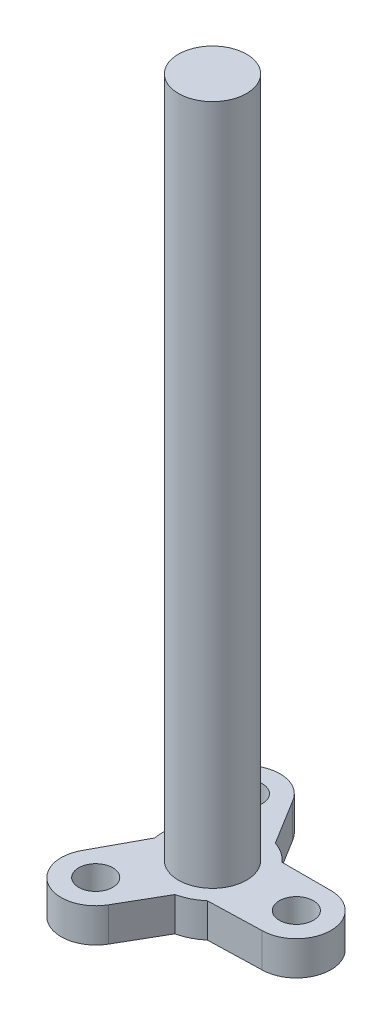
ISO-10303-21;
HEADER;
FILE_DESCRIPTION(('STEP AP214'),'2;1');
FILE_NAME('part.step','',(''),(''),'','','');
FILE_SCHEMA(('AUTOMOTIVE_DESIGN { 1 0 10303 214 1 1 1 1 }'));
ENDSEC;
DATA;
#1=APPLICATION_CONTEXT('core data for automotive mechanical design processes');
#2=APPLICATION_PROTOCOL_DEFINITION('international standard','automotive_design',2000,#1);
#3=PRODUCT_CONTEXT('',#1,'mechanical');
#4=PRODUCT('Part','Part','',(#3));
#5=PRODUCT_RELATED_PRODUCT_CATEGORY('part','',(#4));
#6=PRODUCT_DEFINITION_FORMATION('','',#4);
#7=PRODUCT_DEFINITION_CONTEXT('part definition',#1,'design');
#8=PRODUCT_DEFINITION('design','',#6,#7);
#9=PRODUCT_DEFINITION_SHAPE('','',#8);
#10=(LENGTH_UNIT() NAMED_UNIT(*) SI_UNIT(.MILLI.,.METRE.));
#11=(NAMED_UNIT(*) PLANE_ANGLE_UNIT() SI_UNIT($,.RADIAN.));
#12=(NAMED_UNIT(*) SI_UNIT($,.STERADIAN.) SOLID_ANGLE_UNIT());
#13=UNCERTAINTY_MEASURE_WITH_UNIT(LENGTH_MEASURE(1.E-05),#10,'distance_accuracy_value','');
#14=(GEOMETRIC_REPRESENTATION_CONTEXT(3) GLOBAL_UNCERTAINTY_ASSIGNED_CONTEXT((#13)) GLOBAL_UNIT_ASSIGNED_CONTEXT((#10,
#11,#12)) REPRESENTATION_CONTEXT('',''));
#15=CARTESIAN_POINT('',(0.,0.,0.));
#16=DIRECTION('',(0.,0.,1.));
#17=DIRECTION('',(1.,0.,0.));
#18=AXIS2_PLACEMENT_3D('',#15,#16,#17);
#19=CARTESIAN_POINT('',(4.99942354994192,-2.,0.0759221198740295));
#20=DIRECTION('',(0.,1.,0.));
#21=DIRECTION('',(0.,0.,1.));
#22=AXIS2_PLACEMENT_3D('',#19,#20,#21);
#23=CYLINDRICAL_SURFACE('',#22,1.);
#24=CARTESIAN_POINT('',(4.99942354994192,-2.,0.0759221198740295));
#25=DIRECTION('',(0.,-1.,0.));
#26=DIRECTION('',(0.,0.,-1.));
#27=AXIS2_PLACEMENT_3D('',#24,#25,#26);
#28=CIRCLE('',#27,1.);
#29=CARTESIAN_POINT('',(4.99942354994192,-2.,-0.92407788012597));
#30=VERTEX_POINT('',#29);
#31=EDGE_CURVE('E284',#30,#30,#28,.T.);
#32=ORIENTED_EDGE('',*,*,#31,.T.);
#33=EDGE_LOOP('',(#32));
#34=FACE_BOUND('',#33,.T.);
#35=CARTESIAN_POINT('',(4.99942354994192,0.,0.0759221198740295));
#36=DIRECTION('',(0.,-1.,0.));
#37=DIRECTION('',(0.,0.,-1.));
#38=AXIS2_PLACEMENT_3D('',#35,#36,#37);
#39=CIRCLE('',#38,1.);
#40=CARTESIAN_POINT('',(4.99942354994192,0.,-0.92407788012597));
#41=VERTEX_POINT('',#40);
#42=EDGE_CURVE('E270',#41,#41,#39,.T.);
#43=ORIENTED_EDGE('',*,*,#42,.F.);
#44=EDGE_LOOP('',(#43));
#45=FACE_BOUND('',#44,.T.);
#46=ADVANCED_FACE('F133',(#34,#45),#23,.F.);
#47=CARTESIAN_POINT('',(-2.4339612904509,-2.,-4.36758885846488));
#48=DIRECTION('',(0.,1.,0.));
#49=DIRECTION('',(0.,0.,1.));
#50=AXIS2_PLACEMENT_3D('',#47,#48,#49);
#51=CYLINDRICAL_SURFACE('',#50,1.);
#52=CARTESIAN_POINT('',(-2.4339612904509,-2.,-4.36758885846488));
#53=DIRECTION('',(0.,-1.,0.));
#54=DIRECTION('',(0.,0.,-1.));
#55=AXIS2_PLACEMENT_3D('',#52,#53,#54);
#56=CIRCLE('',#55,1.);
#57=CARTESIAN_POINT('',(-2.4339612904509,-2.,-5.36758885846488));
#58=VERTEX_POINT('',#57);
#59=EDGE_CURVE('E258',#58,#58,#56,.T.);
#60=ORIENTED_EDGE('',*,*,#59,.T.);
#61=EDGE_LOOP('',(#60));
#62=FACE_BOUND('',#61,.T.);
#63=CARTESIAN_POINT('',(-2.4339612904509,0.,-4.36758885846488));
#64=DIRECTION('',(0.,-1.,0.));
#65=DIRECTION('',(0.,0.,-1.));
#66=AXIS2_PLACEMENT_3D('',#63,#64,#65);
#67=CIRCLE('',#66,1.);
#68=CARTESIAN_POINT('',(-2.4339612904509,0.,-5.36758885846488));
#69=VERTEX_POINT('',#68);
#70=EDGE_CURVE('E274',#69,#69,#67,.T.);
#71=ORIENTED_EDGE('',*,*,#70,.F.);
#72=EDGE_LOOP('',(#71));
#73=FACE_BOUND('',#72,.T.);
#74=ADVANCED_FACE('F374',(#62,#73),#51,.F.);
#75=CARTESIAN_POINT('',(0.0645760588909861,-2.,2.24672430709711));
#76=DIRECTION('',(-0.0287304505466221,0.,-0.999587195401876));
#77=DIRECTION('',(-0.999587195401876,0.,0.0287304505466221));
#78=AXIS2_PLACEMENT_3D('',#75,#76,#77);
#79=PLANE('',#78);
#80=DIRECTION('',(-0.999587195401876,0.,0.0287304505466221));
#81=VECTOR('',#80,1.);
#82=CARTESIAN_POINT('',(0.0645760588909861,0.,2.24672430709711));
#83=LINE('',#82,#81);
#84=CARTESIAN_POINT('',(4.99942354994192,0.,2.10488536353225));
#85=VERTEX_POINT('',#84);
#86=CARTESIAN_POINT('',(1.89164149743137,0.,2.19421021581133));
#87=VERTEX_POINT('',#86);
#88=EDGE_CURVE('E312',#85,#87,#83,.T.);
#89=ORIENTED_EDGE('',*,*,#88,.T.);
#90=DIRECTION('',(0.,1.,0.));
#91=VECTOR('',#90,1.);
#92=CARTESIAN_POINT('',(1.89164149743137,-2.,2.19421021581133));
#93=LINE('',#92,#91);
#94=CARTESIAN_POINT('',(1.89164149743137,-2.,2.19421021581133));
#95=VERTEX_POINT('',#94);
#96=EDGE_CURVE('E143',#95,#87,#93,.T.);
#97=ORIENTED_EDGE('',*,*,#96,.F.);
#98=DIRECTION('',(-0.999587195401876,0.,0.0287304505466221));
#99=VECTOR('',#98,1.);
#100=CARTESIAN_POINT('',(0.0645760588909861,-2.,2.24672430709711));
#101=LINE('',#100,#99);
#102=CARTESIAN_POINT('',(4.99942354994192,-2.,2.10488536353225));
#103=VERTEX_POINT('',#102);
#104=EDGE_CURVE('E203',#103,#95,#101,.T.);
#105=ORIENTED_EDGE('',*,*,#104,.F.);
#106=DIRECTION('',(0.,1.,0.));
#107=VECTOR('',#106,1.);
#108=CARTESIAN_POINT('',(4.99942354994192,-2.,2.10488536353225));
#109=LINE('',#108,#107);
#110=EDGE_CURVE('E13',#103,#85,#109,.T.);
#111=ORIENTED_EDGE('',*,*,#110,.T.);
#112=EDGE_LOOP('',(#89,#97,#105,#111));
#113=FACE_BOUND('',#112,.T.);
#114=ADVANCED_FACE('F380',(#113),#79,.F.);
#115=CARTESIAN_POINT('',(0.,-2.,0.));
#116=DIRECTION('',(0.,1.,0.));
#117=DIRECTION('',(0.,0.,1.));
#118=AXIS2_PLACEMENT_3D('',#115,#116,#117);
#119=CYLINDRICAL_SURFACE('',#118,2.89704436037407);
#120=CARTESIAN_POINT('',(0.,0.,0.));
#121=DIRECTION('',(0.,-1.,0.));
#122=DIRECTION('',(0.,0.,-1.));
#123=AXIS2_PLACEMENT_3D('',#120,#121,#122);
#124=CIRCLE('',#123,2.89704436037407);
#125=CARTESIAN_POINT('',(0.621512161444119,0.,2.82959160642525));
#126=VERTEX_POINT('',#125);
#127=EDGE_CURVE('E334',#87,#126,#124,.T.);
#128=ORIENTED_EDGE('',*,*,#127,.T.);
#129=DIRECTION('',(0.,1.,0.));
#130=VECTOR('',#129,1.);
#131=CARTESIAN_POINT('',(0.621512161444119,-2.,2.82959160642525));
#132=LINE('',#131,#130);
#133=CARTESIAN_POINT('',(0.621512161444119,-2.,2.82959160642525));
#134=VERTEX_POINT('',#133);
#135=EDGE_CURVE('E298',#134,#126,#132,.T.);
#136=ORIENTED_EDGE('',*,*,#135,.F.);
#137=CARTESIAN_POINT('',(0.,-2.,0.));
#138=DIRECTION('',(0.,-1.,0.));
#139=DIRECTION('',(0.,0.,-1.));
#140=AXIS2_PLACEMENT_3D('',#137,#138,#139);
#141=CIRCLE('',#140,2.89704436037407);
#142=EDGE_CURVE('E257',#95,#134,#141,.T.);
#143=ORIENTED_EDGE('',*,*,#142,.F.);
#144=ORIENTED_EDGE('',*,*,#96,.T.);
#145=EDGE_LOOP('',(#128,#136,#143,#144));
#146=FACE_BOUND('',#145,.T.);
#147=ADVANCED_FACE('F392',(#146),#119,.T.);
#148=CARTESIAN_POINT('',(1.69138322783282,-2.,0.976520561892078));
#149=DIRECTION('',(0.866025403784443,0.,0.499999999999992));
#150=DIRECTION('',(0.499999999999992,0.,-0.866025403784443));
#151=AXIS2_PLACEMENT_3D('',#148,#149,#150);
#152=PLANE('',#151);
#153=DIRECTION('',(0.499999999999992,0.,-0.866025403784443));
#154=VECTOR('',#153,1.);
#155=CARTESIAN_POINT('',(1.69138322783282,0.,0.976520561892078));
#156=LINE('',#155,#154);
#157=CARTESIAN_POINT('',(-0.808328547138092,0.,5.30614836041998));
#158=VERTEX_POINT('',#157);
#159=EDGE_CURVE('E330',#158,#126,#156,.T.);
#160=ORIENTED_EDGE('',*,*,#159,.F.);
#161=DIRECTION('',(0.,1.,0.));
#162=VECTOR('',#161,1.);
#163=CARTESIAN_POINT('',(-0.808328547138092,-2.,5.30614836041998));
#164=LINE('',#163,#162);
#165=CARTESIAN_POINT('',(-0.808328547138092,-2.,5.30614836041998));
#166=VERTEX_POINT('',#165);
#167=EDGE_CURVE('E296',#166,#158,#164,.T.);
#168=ORIENTED_EDGE('',*,*,#167,.F.);
#169=DIRECTION('',(0.499999999999992,0.,-0.866025403784443));
#170=VECTOR('',#169,1.);
#171=CARTESIAN_POINT('',(1.69138322783282,-2.,0.976520561892078));
#172=LINE('',#171,#170);
#173=EDGE_CURVE('E264',#166,#134,#172,.T.);
#174=ORIENTED_EDGE('',*,*,#173,.T.);
#175=ORIENTED_EDGE('',*,*,#135,.T.);
#176=EDGE_LOOP('',(#160,#168,#174,#175));
#177=FACE_BOUND('',#176,.T.);
#178=ADVANCED_FACE('F396',(#177),#152,.T.);
#179=CARTESIAN_POINT('',(-1.97800835469159,-2.,-1.06743764607266));
#180=DIRECTION('',(0.88003312978898,0.,0.474912297665383));
#181=DIRECTION('',(0.474912297665382,0.,-0.88003312978898));
#182=AXIS2_PLACEMENT_3D('',#179,#180,#181);
#183=PLANE('',#182);
#184=DIRECTION('',(0.474912297665382,0.,-0.88003312978898));
#185=VECTOR('',#184,1.);
#186=CARTESIAN_POINT('',(-1.97800835469159,0.,-1.06743764607266));
#187=LINE('',#186,#185);
#188=CARTESIAN_POINT('',(-4.3225959718439,0.,3.2771851167618));
#189=VERTEX_POINT('',#188);
#190=CARTESIAN_POINT('',(-2.84606253685163,0.,0.541104483722762));
#191=VERTEX_POINT('',#190);
#192=EDGE_CURVE('E322',#189,#191,#187,.T.);
#193=ORIENTED_EDGE('',*,*,#192,.T.);
#194=DIRECTION('',(0.,1.,0.));
#195=VECTOR('',#194,1.);
#196=CARTESIAN_POINT('',(-2.84606253685163,-2.,0.541104483722762));
#197=LINE('',#196,#195);
#198=CARTESIAN_POINT('',(-2.84606253685163,-2.,0.541104483722762));
#199=VERTEX_POINT('',#198);
#200=EDGE_CURVE('E291',#199,#191,#197,.T.);
#201=ORIENTED_EDGE('',*,*,#200,.F.);
#202=DIRECTION('',(0.474912297665382,0.,-0.88003312978898));
#203=VECTOR('',#202,1.);
#204=CARTESIAN_POINT('',(-1.97800835469159,-2.,-1.06743764607266));
#205=LINE('',#204,#203);
#206=CARTESIAN_POINT('',(-4.3225959718439,-2.,3.2771851167618));
#207=VERTEX_POINT('',#206);
#208=EDGE_CURVE('E263',#207,#199,#205,.T.);
#209=ORIENTED_EDGE('',*,*,#208,.F.);
#210=DIRECTION('',(0.,1.,0.));
#211=VECTOR('',#210,1.);
#212=CARTESIAN_POINT('',(-4.3225959718439,-2.,3.2771851167618));
#213=LINE('',#212,#211);
#214=EDGE_CURVE('E294',#207,#189,#213,.T.);
#215=ORIENTED_EDGE('',*,*,#214,.T.);
#216=EDGE_LOOP('',(#193,#201,#209,#215));
#217=FACE_BOUND('',#216,.T.);
#218=ADVANCED_FACE('F356',(#217),#183,.F.);
#219=CARTESIAN_POINT('',(-2.76125429422154,0.,-0.876550482641058));
#220=VERTEX_POINT('',#219);
#221=EDGE_CURVE('E327',#191,#220,#124,.T.);
#222=ORIENTED_EDGE('',*,*,#221,.T.);
#223=DIRECTION('',(0.,1.,0.));
#224=VECTOR('',#223,1.);
#225=CARTESIAN_POINT('',(-2.76125429422154,-2.,-0.876550482641058));
#226=LINE('',#225,#224);
#227=CARTESIAN_POINT('',(-2.76125429422154,-2.,-0.876550482641058));
#228=VERTEX_POINT('',#227);
#229=EDGE_CURVE('E289',#228,#220,#226,.T.);
#230=ORIENTED_EDGE('',*,*,#229,.F.);
#231=EDGE_CURVE('E256',#199,#228,#141,.T.);
#232=ORIENTED_EDGE('',*,*,#231,.F.);
#233=ORIENTED_EDGE('',*,*,#200,.T.);
#234=EDGE_LOOP('',(#222,#230,#232,#233));
#235=FACE_BOUND('',#234,.T.);
#236=ADVANCED_FACE('F358',(#235),#119,.T.);
#237=CARTESIAN_POINT('',(-1.69138322783281,-2.,0.976520561892103));
#238=DIRECTION('',(-0.866025403784436,0.,0.500000000000004));
#239=DIRECTION('',(0.500000000000004,0.,0.866025403784436));
#240=AXIS2_PLACEMENT_3D('',#237,#238,#239);
#241=PLANE('',#240);
#242=DIRECTION('',(0.500000000000004,0.,0.866025403784436));
#243=VECTOR('',#242,1.);
#244=CARTESIAN_POINT('',(-1.69138322783281,0.,0.976520561892103));
#245=LINE('',#244,#243);
#246=CARTESIAN_POINT('',(-4.19109500280379,0.,-3.35310723663577));
#247=VERTEX_POINT('',#246);
#248=EDGE_CURVE('E332',#247,#220,#245,.T.);
#249=ORIENTED_EDGE('',*,*,#248,.F.);
#250=DIRECTION('',(0.,1.,0.));
#251=VECTOR('',#250,1.);
#252=CARTESIAN_POINT('',(-4.19109500280379,-2.,-3.35310723663577));
#253=LINE('',#252,#251);
#254=CARTESIAN_POINT('',(-4.19109500280379,-2.,-3.35310723663577));
#255=VERTEX_POINT('',#254);
#256=EDGE_CURVE('E287',#255,#247,#253,.T.);
#257=ORIENTED_EDGE('',*,*,#256,.F.);
#258=DIRECTION('',(0.500000000000004,0.,0.866025403784436));
#259=VECTOR('',#258,1.);
#260=CARTESIAN_POINT('',(-1.69138322783281,-2.,0.976520561892103));
#261=LINE('',#260,#259);
#262=EDGE_CURVE('E262',#255,#228,#261,.T.);
#263=ORIENTED_EDGE('',*,*,#262,.T.);
#264=ORIENTED_EDGE('',*,*,#229,.T.);
#265=EDGE_LOOP('',(#249,#257,#263,#264));
#266=FACE_BOUND('',#265,.T.);
#267=ADVANCED_FACE('F361',(#266),#241,.T.);
#268=CARTESIAN_POINT('',(-2.4339612904509,-2.,-4.36758885846488));
#269=DIRECTION('',(0.,1.,0.));
#270=DIRECTION('',(0.,0.,1.));
#271=AXIS2_PLACEMENT_3D('',#268,#269,#270);
#272=CYLINDRICAL_SURFACE('',#271,2.02896324365822);
#273=CARTESIAN_POINT('',(-2.4339612904509,0.,-4.36758885846488));
#274=DIRECTION('',(0.,-1.,0.));
#275=DIRECTION('',(0.,0.,-1.));
#276=AXIS2_PLACEMENT_3D('',#273,#274,#275);
#277=CIRCLE('',#276,2.02896324365822);
#278=CARTESIAN_POINT('',(-0.676827578098013,0.,-5.382070480294));
#279=VERTEX_POINT('',#278);
#280=EDGE_CURVE('E339',#247,#279,#277,.T.);
#281=ORIENTED_EDGE('',*,*,#280,.T.);
#282=DIRECTION('',(0.,1.,0.));
#283=VECTOR('',#282,1.);
#284=CARTESIAN_POINT('',(-0.676827578098013,-2.,-5.382070480294));
#285=LINE('',#284,#283);
#286=CARTESIAN_POINT('',(-0.676827578098013,-2.,-5.382070480294));
#287=VERTEX_POINT('',#286);
#288=EDGE_CURVE('E251',#287,#279,#285,.T.);
#289=ORIENTED_EDGE('',*,*,#288,.F.);
#290=CARTESIAN_POINT('',(-2.4339612904509,-2.,-4.36758885846488));
#291=DIRECTION('',(0.,-1.,0.));
#292=DIRECTION('',(0.,0.,-1.));
#293=AXIS2_PLACEMENT_3D('',#290,#291,#292);
#294=CIRCLE('',#293,2.02896324365822);
#295=EDGE_CURVE('E239',#255,#287,#294,.T.);
#296=ORIENTED_EDGE('',*,*,#295,.F.);
#297=ORIENTED_EDGE('',*,*,#256,.T.);
#298=EDGE_LOOP('',(#281,#289,#296,#297));
#299=FACE_BOUND('',#298,.T.);
#300=ADVANCED_FACE('F364',(#299),#272,.T.);
#301=CARTESIAN_POINT('',(1.91343229580059,-2.,-1.17928666102444));
#302=DIRECTION('',(-0.851302679242351,0.,0.524674897736489));
#303=DIRECTION('',(0.524674897736489,0.,0.851302679242351));
#304=AXIS2_PLACEMENT_3D('',#301,#302,#303);
#305=PLANE('',#304);
#306=DIRECTION('',(0.524674897736489,0.,0.851302679242351));
#307=VECTOR('',#306,1.);
#308=CARTESIAN_POINT('',(1.91343229580059,0.,-1.17928666102444));
#309=LINE('',#308,#307);
#310=CARTESIAN_POINT('',(0.954421039420251,0.,-2.73531469953407));
#311=VERTEX_POINT('',#310);
#312=EDGE_CURVE('E248',#279,#311,#309,.T.);
#313=ORIENTED_EDGE('',*,*,#312,.T.);
#314=DIRECTION('',(0.,1.,0.));
#315=VECTOR('',#314,1.);
#316=CARTESIAN_POINT('',(0.954421039420251,-2.,-2.73531469953407));
#317=LINE('',#316,#315);
#318=CARTESIAN_POINT('',(0.954421039420251,-2.,-2.73531469953407));
#319=VERTEX_POINT('',#318);
#320=EDGE_CURVE('E245',#319,#311,#317,.T.);
#321=ORIENTED_EDGE('',*,*,#320,.F.);
#322=DIRECTION('',(0.524674897736489,0.,0.851302679242351));
#323=VECTOR('',#322,1.);
#324=CARTESIAN_POINT('',(1.91343229580059,-2.,-1.17928666102444));
#325=LINE('',#324,#323);
#326=EDGE_CURVE('E230',#287,#319,#325,.T.);
#327=ORIENTED_EDGE('',*,*,#326,.F.);
#328=ORIENTED_EDGE('',*,*,#288,.T.);
#329=EDGE_LOOP('',(#313,#321,#327,#328));
#330=FACE_BOUND('',#329,.T.);
#331=ADVANCED_FACE('F246',(#330),#305,.F.);
#332=CARTESIAN_POINT('',(2.13974213277745,0.,-1.95304112378419));
#333=VERTEX_POINT('',#332);
#334=EDGE_CURVE('E335',#311,#333,#124,.T.);
#335=ORIENTED_EDGE('',*,*,#334,.T.);
#336=DIRECTION('',(0.,1.,0.));
#337=VECTOR('',#336,1.);
#338=CARTESIAN_POINT('',(2.13974213277745,-2.,-1.95304112378419));
#339=LINE('',#338,#337);
#340=CARTESIAN_POINT('',(2.13974213277745,-2.,-1.95304112378419));
#341=VERTEX_POINT('',#340);
#342=EDGE_CURVE('E191',#341,#333,#339,.T.);
#343=ORIENTED_EDGE('',*,*,#342,.F.);
#344=EDGE_CURVE('E236',#319,#341,#141,.T.);
#345=ORIENTED_EDGE('',*,*,#344,.F.);
#346=ORIENTED_EDGE('',*,*,#320,.T.);
#347=EDGE_LOOP('',(#335,#343,#345,#346));
#348=FACE_BOUND('',#347,.T.);
#349=ADVANCED_FACE('F253',(#348),#119,.T.);
#350=CARTESIAN_POINT('',(0.,-2.,-1.95304112378419));
#351=DIRECTION('',(0.,0.,-1.));
#352=DIRECTION('',(-1.,0.,0.));
#353=AXIS2_PLACEMENT_3D('',#350,#351,#352);
#354=PLANE('',#353);
#355=DIRECTION('',(-1.,0.,0.));
#356=VECTOR('',#355,1.);
#357=CARTESIAN_POINT('',(0.,0.,-1.95304112378419));
#358=LINE('',#357,#356);
#359=CARTESIAN_POINT('',(4.99942354994192,0.,-1.95304112378419));
#360=VERTEX_POINT('',#359);
#361=EDGE_CURVE('E279',#360,#333,#358,.T.);
#362=ORIENTED_EDGE('',*,*,#361,.F.);
#363=DIRECTION('',(0.,1.,0.));
#364=VECTOR('',#363,1.);
#365=CARTESIAN_POINT('',(4.99942354994192,-2.,-1.95304112378419));
#366=LINE('',#365,#364);
#367=CARTESIAN_POINT('',(4.99942354994192,-2.,-1.95304112378419));
#368=VERTEX_POINT('',#367);
#369=EDGE_CURVE('E152',#368,#360,#366,.T.);
#370=ORIENTED_EDGE('',*,*,#369,.F.);
#371=DIRECTION('',(-1.,0.,0.));
#372=VECTOR('',#371,1.);
#373=CARTESIAN_POINT('',(0.,-2.,-1.95304112378419));
#374=LINE('',#373,#372);
#375=EDGE_CURVE('E254',#368,#341,#374,.T.);
#376=ORIENTED_EDGE('',*,*,#375,.T.);
#377=ORIENTED_EDGE('',*,*,#342,.T.);
#378=EDGE_LOOP('',(#362,#370,#376,#377));
#379=FACE_BOUND('',#378,.T.);
#380=ADVANCED_FACE('F387',(#379),#354,.T.);
#381=CARTESIAN_POINT('',(4.99942354994192,-2.,0.0759221198740295));
#382=DIRECTION('',(0.,1.,0.));
#383=DIRECTION('',(0.,0.,1.));
#384=AXIS2_PLACEMENT_3D('',#381,#382,#383);
#385=CYLINDRICAL_SURFACE('',#384,2.02896324365822);
#386=CARTESIAN_POINT('',(4.99942354994192,0.,0.0759221198740295));
#387=DIRECTION('',(0.,-1.,0.));
#388=DIRECTION('',(0.,0.,-1.));
#389=AXIS2_PLACEMENT_3D('',#386,#387,#388);
#390=CIRCLE('',#389,2.02896324365822);
#391=EDGE_CURVE('E309',#360,#85,#390,.T.);
#392=ORIENTED_EDGE('',*,*,#391,.T.);
#393=ORIENTED_EDGE('',*,*,#110,.F.);
#394=CARTESIAN_POINT('',(4.99942354994192,-2.,0.0759221198740295));
#395=DIRECTION('',(0.,-1.,0.));
#396=DIRECTION('',(0.,0.,-1.));
#397=AXIS2_PLACEMENT_3D('',#394,#395,#396);
#398=CIRCLE('',#397,2.02896324365822);
#399=EDGE_CURVE('E269',#368,#103,#398,.T.);
#400=ORIENTED_EDGE('',*,*,#399,.F.);
#401=ORIENTED_EDGE('',*,*,#369,.T.);
#402=EDGE_LOOP('',(#392,#393,#400,#401));
#403=FACE_BOUND('',#402,.T.);
#404=ADVANCED_FACE('F390',(#403),#385,.T.);
#405=CARTESIAN_POINT('',(0.,0.,0.));
#406=DIRECTION('',(0.,-1.,0.));
#407=DIRECTION('',(0.,0.,-1.));
#408=AXIS2_PLACEMENT_3D('',#405,#406,#407);
#409=PLANE('',#408);
#410=ORIENTED_EDGE('',*,*,#391,.F.);
#411=ORIENTED_EDGE('',*,*,#361,.T.);
#412=ORIENTED_EDGE('',*,*,#334,.F.);
#413=ORIENTED_EDGE('',*,*,#312,.F.);
#414=ORIENTED_EDGE('',*,*,#280,.F.);
#415=ORIENTED_EDGE('',*,*,#248,.T.);
#416=ORIENTED_EDGE('',*,*,#221,.F.);
#417=ORIENTED_EDGE('',*,*,#192,.F.);
#418=CARTESIAN_POINT('',(-2.56546225949099,0.,4.29166673859089));
#419=DIRECTION('',(0.,-1.,0.));
#420=DIRECTION('',(0.,0.,-1.));
#421=AXIS2_PLACEMENT_3D('',#418,#419,#420);
#422=CIRCLE('',#421,2.02896324365822);
#423=EDGE_CURVE('E137',#158,#189,#422,.T.);
#424=ORIENTED_EDGE('',*,*,#423,.F.);
#425=ORIENTED_EDGE('',*,*,#159,.T.);
#426=ORIENTED_EDGE('',*,*,#127,.F.);
#427=ORIENTED_EDGE('',*,*,#88,.F.);
#428=EDGE_LOOP('',(#410,#411,#412,#413,#414,#415,#416,#417,#424,#425,#426,#427));
#429=FACE_BOUND('',#428,.T.);
#430=ORIENTED_EDGE('',*,*,#70,.T.);
#431=EDGE_LOOP('',(#430));
#432=FACE_BOUND('',#431,.T.);
#433=ORIENTED_EDGE('',*,*,#42,.T.);
#434=EDGE_LOOP('',(#433));
#435=FACE_BOUND('',#434,.T.);
#436=CARTESIAN_POINT('',(-2.56546225949099,0.,4.29166673859089));
#437=DIRECTION('',(0.,-1.,0.));
#438=DIRECTION('',(0.,0.,-1.));
#439=AXIS2_PLACEMENT_3D('',#436,#437,#438);
#440=CIRCLE('',#439,1.);
#441=CARTESIAN_POINT('',(-2.56546225949099,0.,3.29166673859089));
#442=VERTEX_POINT('',#441);
#443=EDGE_CURVE('E305',#442,#442,#440,.T.);
#444=ORIENTED_EDGE('',*,*,#443,.T.);
#445=EDGE_LOOP('',(#444));
#446=FACE_BOUND('',#445,.T.);
#447=ADVANCED_FACE('F323',(#429,#432,#435,#446),#409,.F.);
#448=CARTESIAN_POINT('',(0.,-2.,0.));
#449=DIRECTION('',(0.,-1.,0.));
#450=DIRECTION('',(0.,0.,-1.));
#451=AXIS2_PLACEMENT_3D('',#448,#449,#450);
#452=PLANE('',#451);
#453=ORIENTED_EDGE('',*,*,#399,.T.);
#454=ORIENTED_EDGE('',*,*,#104,.T.);
#455=ORIENTED_EDGE('',*,*,#142,.T.);
#456=ORIENTED_EDGE('',*,*,#173,.F.);
#457=CARTESIAN_POINT('',(-2.56546225949099,-2.,4.29166673859089));
#458=DIRECTION('',(0.,-1.,0.));
#459=DIRECTION('',(0.,0.,-1.));
#460=AXIS2_PLACEMENT_3D('',#457,#458,#459);
#461=CIRCLE('',#460,2.02896324365822);
#462=EDGE_CURVE('E307',#166,#207,#461,.T.);
#463=ORIENTED_EDGE('',*,*,#462,.T.);
#464=ORIENTED_EDGE('',*,*,#208,.T.);
#465=ORIENTED_EDGE('',*,*,#231,.T.);
#466=ORIENTED_EDGE('',*,*,#262,.F.);
#467=ORIENTED_EDGE('',*,*,#295,.T.);
#468=ORIENTED_EDGE('',*,*,#326,.T.);
#469=ORIENTED_EDGE('',*,*,#344,.T.);
#470=ORIENTED_EDGE('',*,*,#375,.F.);
#471=EDGE_LOOP('',(#453,#454,#455,#456,#463,#464,#465,#466,#467,#468,#469,#470));
#472=FACE_BOUND('',#471,.T.);
#473=ORIENTED_EDGE('',*,*,#59,.F.);
#474=EDGE_LOOP('',(#473));
#475=FACE_BOUND('',#474,.T.);
#476=ORIENTED_EDGE('',*,*,#31,.F.);
#477=EDGE_LOOP('',(#476));
#478=FACE_BOUND('',#477,.T.);
#479=CARTESIAN_POINT('',(-2.56546225949099,-2.,4.29166673859089));
#480=DIRECTION('',(0.,-1.,0.));
#481=DIRECTION('',(0.,0.,-1.));
#482=AXIS2_PLACEMENT_3D('',#479,#480,#481);
#483=CIRCLE('',#482,1.);
#484=CARTESIAN_POINT('',(-2.56546225949099,-2.,3.29166673859089));
#485=VERTEX_POINT('',#484);
#486=EDGE_CURVE('E302',#485,#485,#483,.T.);
#487=ORIENTED_EDGE('',*,*,#486,.F.);
#488=EDGE_LOOP('',(#487));
#489=FACE_BOUND('',#488,.T.);
#490=ADVANCED_FACE('F232',(#472,#475,#478,#489),#452,.T.);
#491=CARTESIAN_POINT('',(-2.56546225949099,-2.,4.29166673859089));
#492=DIRECTION('',(0.,1.,0.));
#493=DIRECTION('',(0.,0.,1.));
#494=AXIS2_PLACEMENT_3D('',#491,#492,#493);
#495=CYLINDRICAL_SURFACE('',#494,1.);
#496=ORIENTED_EDGE('',*,*,#486,.T.);
#497=EDGE_LOOP('',(#496));
#498=FACE_BOUND('',#497,.T.);
#499=ORIENTED_EDGE('',*,*,#443,.F.);
#500=EDGE_LOOP('',(#499));
#501=FACE_BOUND('',#500,.T.);
#502=ADVANCED_FACE('F411',(#498,#501),#495,.F.);
#503=CARTESIAN_POINT('',(-2.56546225949099,-2.,4.29166673859089));
#504=DIRECTION('',(0.,1.,0.));
#505=DIRECTION('',(0.,0.,1.));
#506=AXIS2_PLACEMENT_3D('',#503,#504,#505);
#507=CYLINDRICAL_SURFACE('',#506,2.02896324365822);
#508=ORIENTED_EDGE('',*,*,#167,.T.);
#509=ORIENTED_EDGE('',*,*,#423,.T.);
#510=ORIENTED_EDGE('',*,*,#214,.F.);
#511=ORIENTED_EDGE('',*,*,#462,.F.);
#512=EDGE_LOOP('',(#508,#509,#510,#511));
#513=FACE_BOUND('',#512,.T.);
#514=ADVANCED_FACE('F135',(#513),#507,.T.);
#515=CLOSED_SHELL('',(#46,#74,#114,#147,#178,#218,#236,#267,#300,#331,#349,#380,#404,#447,#490,
#502,#514));
#516=MANIFOLD_SOLID_BREP('B2',#515);
#517=CARTESIAN_POINT('',(0.,40.,0.));
#518=DIRECTION('',(0.,-1.,0.));
#519=DIRECTION('',(0.,0.,-1.));
#520=AXIS2_PLACEMENT_3D('',#517,#518,#519);
#521=CYLINDRICAL_SURFACE('',#520,2.);
#522=CARTESIAN_POINT('',(0.,40.,0.));
#523=DIRECTION('',(0.,1.,0.));
#524=DIRECTION('',(0.,0.,1.));
#525=AXIS2_PLACEMENT_3D('',#522,#523,#524);
#526=CIRCLE('',#525,2.);
#527=CARTESIAN_POINT('',(0.,40.,2.));
#528=VERTEX_POINT('',#527);
#529=EDGE_CURVE('E132',#528,#528,#526,.T.);
#530=ORIENTED_EDGE('',*,*,#529,.F.);
#531=EDGE_LOOP('',(#530));
#532=FACE_BOUND('',#531,.T.);
#533=CARTESIAN_POINT('',(0.,0.,0.));
#534=DIRECTION('',(0.,1.,0.));
#535=DIRECTION('',(0.,0.,1.));
#536=AXIS2_PLACEMENT_3D('',#533,#534,#535);
#537=CIRCLE('',#536,2.);
#538=CARTESIAN_POINT('',(0.,0.,2.));
#539=VERTEX_POINT('',#538);
#540=EDGE_CURVE('E603',#539,#539,#537,.T.);
#541=ORIENTED_EDGE('',*,*,#540,.T.);
#542=EDGE_LOOP('',(#541));
#543=FACE_BOUND('',#542,.T.);
#544=ADVANCED_FACE('F600',(#532,#543),#521,.T.);
#545=CARTESIAN_POINT('',(0.,40.,0.));
#546=DIRECTION('',(0.,1.,0.));
#547=DIRECTION('',(0.,0.,1.));
#548=AXIS2_PLACEMENT_3D('',#545,#546,#547);
#549=PLANE('',#548);
#550=ORIENTED_EDGE('',*,*,#529,.T.);
#551=EDGE_LOOP('',(#550));
#552=FACE_BOUND('',#551,.T.);
#553=ADVANCED_FACE('F617',(#552),#549,.T.);
#554=CARTESIAN_POINT('',(0.,0.,0.));
#555=DIRECTION('',(0.,1.,0.));
#556=DIRECTION('',(0.,0.,1.));
#557=AXIS2_PLACEMENT_3D('',#554,#555,#556);
#558=PLANE('',#557);
#559=ORIENTED_EDGE('',*,*,#540,.F.);
#560=EDGE_LOOP('',(#559));
#561=FACE_BOUND('',#560,.T.);
#562=ADVANCED_FACE('F615',(#561),#558,.F.);
#563=CLOSED_SHELL('',(#544,#553,#562));
#564=MANIFOLD_SOLID_BREP('B7',#563);
#565=ADVANCED_BREP_SHAPE_REPRESENTATION('',(#18,#516,#564),#14);
#566=SHAPE_DEFINITION_REPRESENTATION(#9,#565);
ENDSEC;
END-ISO-10303-21;
